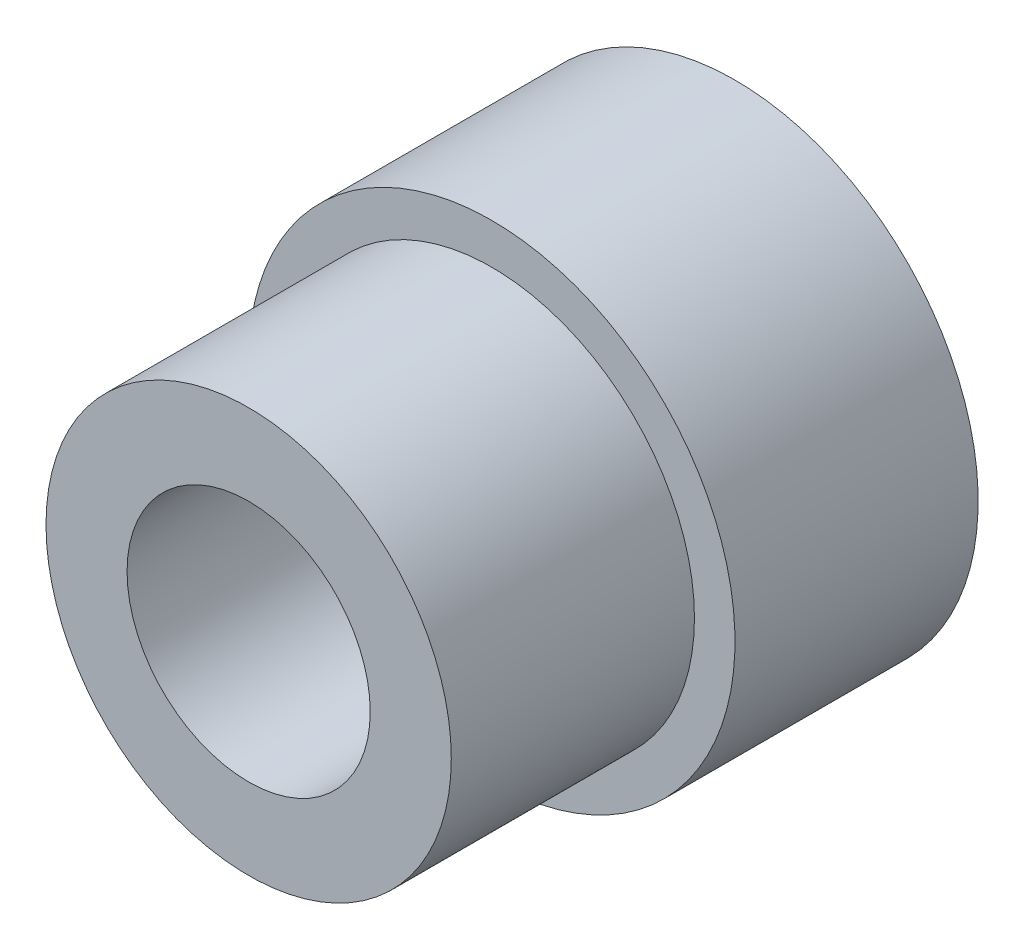
ISO-10303-21;
HEADER;
FILE_DESCRIPTION(('STEP AP214'),'2;1');
FILE_NAME('part.step','',(''),(''),'','','');
FILE_SCHEMA(('AUTOMOTIVE_DESIGN { 1 0 10303 214 1 1 1 1 }'));
ENDSEC;
DATA;
#1=APPLICATION_CONTEXT('core data for automotive mechanical design processes');
#2=APPLICATION_PROTOCOL_DEFINITION('international standard','automotive_design',2000,#1);
#3=PRODUCT_CONTEXT('',#1,'mechanical');
#4=PRODUCT('Part','Part','',(#3));
#5=PRODUCT_RELATED_PRODUCT_CATEGORY('part','',(#4));
#6=PRODUCT_DEFINITION_FORMATION('','',#4);
#7=PRODUCT_DEFINITION_CONTEXT('part definition',#1,'design');
#8=PRODUCT_DEFINITION('design','',#6,#7);
#9=PRODUCT_DEFINITION_SHAPE('','',#8);
#10=(LENGTH_UNIT() NAMED_UNIT(*) SI_UNIT(.MILLI.,.METRE.));
#11=(NAMED_UNIT(*) PLANE_ANGLE_UNIT() SI_UNIT($,.RADIAN.));
#12=(NAMED_UNIT(*) SI_UNIT($,.STERADIAN.) SOLID_ANGLE_UNIT());
#13=UNCERTAINTY_MEASURE_WITH_UNIT(LENGTH_MEASURE(1.E-05),#10,'distance_accuracy_value','');
#14=(GEOMETRIC_REPRESENTATION_CONTEXT(3) GLOBAL_UNCERTAINTY_ASSIGNED_CONTEXT((#13)) GLOBAL_UNIT_ASSIGNED_CONTEXT((#10,
#11,#12)) REPRESENTATION_CONTEXT('',''));
#15=CARTESIAN_POINT('',(0.,0.,0.));
#16=DIRECTION('',(0.,0.,1.));
#17=DIRECTION('',(1.,0.,0.));
#18=AXIS2_PLACEMENT_3D('',#15,#16,#17);
#19=CARTESIAN_POINT('',(0.,0.,30.));
#20=DIRECTION('',(0.,0.,1.));
#21=DIRECTION('',(1.,0.,0.));
#22=AXIS2_PLACEMENT_3D('',#19,#20,#21);
#23=PLANE('',#22);
#24=CARTESIAN_POINT('',(0.,0.,30.));
#25=DIRECTION('',(0.,0.,1.));
#26=DIRECTION('',(1.,0.,0.));
#27=AXIS2_PLACEMENT_3D('',#24,#25,#26);
#28=CIRCLE('',#27,25.);
#29=CARTESIAN_POINT('',(25.,0.,30.));
#30=VERTEX_POINT('',#29);
#31=EDGE_CURVE('E10',#30,#30,#28,.T.);
#32=ORIENTED_EDGE('',*,*,#31,.T.);
#33=EDGE_LOOP('',(#32));
#34=FACE_BOUND('',#33,.T.);
#35=CARTESIAN_POINT('',(0.,0.,30.));
#36=DIRECTION('',(0.,0.,1.));
#37=DIRECTION('',(1.,0.,0.));
#38=AXIS2_PLACEMENT_3D('',#35,#36,#37);
#39=CIRCLE('',#38,15.);
#40=CARTESIAN_POINT('',(15.,0.,30.));
#41=VERTEX_POINT('',#40);
#42=EDGE_CURVE('E41',#41,#41,#39,.T.);
#43=ORIENTED_EDGE('',*,*,#42,.F.);
#44=EDGE_LOOP('',(#43));
#45=FACE_BOUND('',#44,.T.);
#46=ADVANCED_FACE('F33',(#34,#45),#23,.T.);
#47=CARTESIAN_POINT('',(0.,0.,30.));
#48=DIRECTION('',(0.,0.,-1.));
#49=DIRECTION('',(-1.,0.,0.));
#50=AXIS2_PLACEMENT_3D('',#47,#48,#49);
#51=CYLINDRICAL_SURFACE('',#50,25.);
#52=ORIENTED_EDGE('',*,*,#31,.F.);
#53=EDGE_LOOP('',(#52));
#54=FACE_BOUND('',#53,.T.);
#55=CARTESIAN_POINT('',(0.,0.,0.));
#56=DIRECTION('',(0.,0.,1.));
#57=DIRECTION('',(1.,0.,0.));
#58=AXIS2_PLACEMENT_3D('',#55,#56,#57);
#59=CIRCLE('',#58,25.);
#60=CARTESIAN_POINT('',(25.,0.,0.));
#61=VERTEX_POINT('',#60);
#62=EDGE_CURVE('E37',#61,#61,#59,.T.);
#63=ORIENTED_EDGE('',*,*,#62,.T.);
#64=EDGE_LOOP('',(#63));
#65=FACE_BOUND('',#64,.T.);
#66=ADVANCED_FACE('F35',(#54,#65),#51,.T.);
#67=CARTESIAN_POINT('',(0.,0.,30.));
#68=DIRECTION('',(0.,0.,-1.));
#69=DIRECTION('',(-1.,0.,0.));
#70=AXIS2_PLACEMENT_3D('',#67,#68,#69);
#71=CYLINDRICAL_SURFACE('',#70,15.);
#72=ORIENTED_EDGE('',*,*,#42,.T.);
#73=EDGE_LOOP('',(#72));
#74=FACE_BOUND('',#73,.T.);
#75=CARTESIAN_POINT('',(0.,0.,-30.));
#76=DIRECTION('',(0.,0.,1.));
#77=DIRECTION('',(1.,0.,0.));
#78=AXIS2_PLACEMENT_3D('',#75,#76,#77);
#79=CIRCLE('',#78,15.);
#80=CARTESIAN_POINT('',(15.,0.,-30.));
#81=VERTEX_POINT('',#80);
#82=EDGE_CURVE('E51',#81,#81,#79,.T.);
#83=ORIENTED_EDGE('',*,*,#82,.F.);
#84=EDGE_LOOP('',(#83));
#85=FACE_BOUND('',#84,.T.);
#86=ADVANCED_FACE('F60',(#74,#85),#71,.F.);
#87=CARTESIAN_POINT('',(0.,0.,-30.));
#88=DIRECTION('',(0.,0.,1.));
#89=DIRECTION('',(1.,0.,0.));
#90=AXIS2_PLACEMENT_3D('',#87,#88,#89);
#91=CYLINDRICAL_SURFACE('',#90,30.);
#92=CARTESIAN_POINT('',(0.,0.,-30.));
#93=DIRECTION('',(0.,0.,-1.));
#94=DIRECTION('',(-1.,0.,0.));
#95=AXIS2_PLACEMENT_3D('',#92,#93,#94);
#96=CIRCLE('',#95,30.);
#97=CARTESIAN_POINT('',(-30.,0.,-30.));
#98=VERTEX_POINT('',#97);
#99=EDGE_CURVE('E50',#98,#98,#96,.T.);
#100=ORIENTED_EDGE('',*,*,#99,.F.);
#101=EDGE_LOOP('',(#100));
#102=FACE_BOUND('',#101,.T.);
#103=CARTESIAN_POINT('',(0.,0.,0.));
#104=DIRECTION('',(0.,0.,-1.));
#105=DIRECTION('',(-1.,0.,0.));
#106=AXIS2_PLACEMENT_3D('',#103,#104,#105);
#107=CIRCLE('',#106,30.);
#108=CARTESIAN_POINT('',(-30.,0.,0.));
#109=VERTEX_POINT('',#108);
#110=EDGE_CURVE('E47',#109,#109,#107,.T.);
#111=ORIENTED_EDGE('',*,*,#110,.T.);
#112=EDGE_LOOP('',(#111));
#113=FACE_BOUND('',#112,.T.);
#114=ADVANCED_FACE('F62',(#102,#113),#91,.T.);
#115=CARTESIAN_POINT('',(0.,0.,-30.));
#116=DIRECTION('',(0.,0.,-1.));
#117=DIRECTION('',(-1.,0.,0.));
#118=AXIS2_PLACEMENT_3D('',#115,#116,#117);
#119=PLANE('',#118);
#120=ORIENTED_EDGE('',*,*,#82,.T.);
#121=EDGE_LOOP('',(#120));
#122=FACE_BOUND('',#121,.T.);
#123=ORIENTED_EDGE('',*,*,#99,.T.);
#124=EDGE_LOOP('',(#123));
#125=FACE_BOUND('',#124,.T.);
#126=ADVANCED_FACE('F57',(#122,#125),#119,.T.);
#127=CARTESIAN_POINT('',(0.,0.,0.));
#128=DIRECTION('',(0.,0.,-1.));
#129=DIRECTION('',(-1.,0.,0.));
#130=AXIS2_PLACEMENT_3D('',#127,#128,#129);
#131=PLANE('',#130);
#132=ORIENTED_EDGE('',*,*,#62,.F.);
#133=EDGE_LOOP('',(#132));
#134=FACE_BOUND('',#133,.T.);
#135=ORIENTED_EDGE('',*,*,#110,.F.);
#136=EDGE_LOOP('',(#135));
#137=FACE_BOUND('',#136,.T.);
#138=ADVANCED_FACE('F95',(#134,#137),#131,.F.);
#139=CLOSED_SHELL('',(#46,#66,#86,#114,#126,#138));
#140=MANIFOLD_SOLID_BREP('B2',#139);
#141=ADVANCED_BREP_SHAPE_REPRESENTATION('',(#18,#140),#14);
#142=SHAPE_DEFINITION_REPRESENTATION(#9,#141);
ENDSEC;
END-ISO-10303-21;
